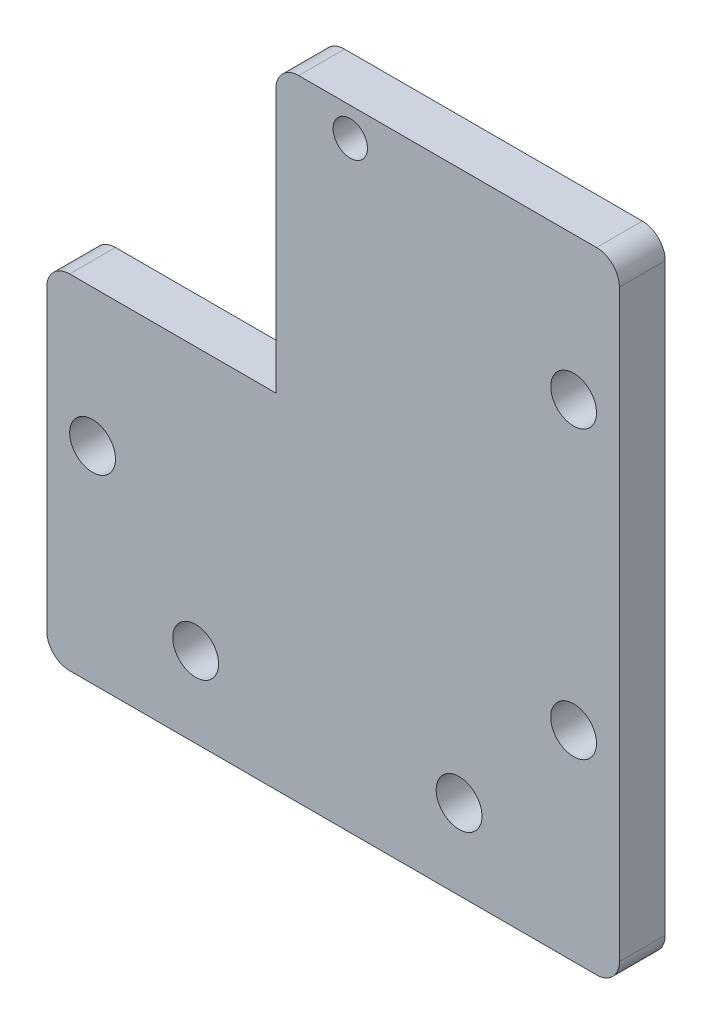
ISO-10303-21;
HEADER;
FILE_DESCRIPTION(('STEP AP214'),'2;1');
FILE_NAME('part.step','',(''),(''),'','','');
FILE_SCHEMA(('AUTOMOTIVE_DESIGN { 1 0 10303 214 1 1 1 1 }'));
ENDSEC;
DATA;
#1=APPLICATION_CONTEXT('core data for automotive mechanical design processes');
#2=APPLICATION_PROTOCOL_DEFINITION('international standard','automotive_design',2000,#1);
#3=PRODUCT_CONTEXT('',#1,'mechanical');
#4=PRODUCT('Part','Part','',(#3));
#5=PRODUCT_RELATED_PRODUCT_CATEGORY('part','',(#4));
#6=PRODUCT_DEFINITION_FORMATION('','',#4);
#7=PRODUCT_DEFINITION_CONTEXT('part definition',#1,'design');
#8=PRODUCT_DEFINITION('design','',#6,#7);
#9=PRODUCT_DEFINITION_SHAPE('','',#8);
#10=(LENGTH_UNIT() NAMED_UNIT(*) SI_UNIT(.MILLI.,.METRE.));
#11=(NAMED_UNIT(*) PLANE_ANGLE_UNIT() SI_UNIT($,.RADIAN.));
#12=(NAMED_UNIT(*) SI_UNIT($,.STERADIAN.) SOLID_ANGLE_UNIT());
#13=UNCERTAINTY_MEASURE_WITH_UNIT(LENGTH_MEASURE(1.E-05),#10,'distance_accuracy_value','');
#14=(GEOMETRIC_REPRESENTATION_CONTEXT(3) GLOBAL_UNCERTAINTY_ASSIGNED_CONTEXT((#13)) GLOBAL_UNIT_ASSIGNED_CONTEXT((#10,
#11,#12)) REPRESENTATION_CONTEXT('',''));
#15=CARTESIAN_POINT('',(0.,0.,0.));
#16=DIRECTION('',(0.,0.,1.));
#17=DIRECTION('',(1.,0.,0.));
#18=AXIS2_PLACEMENT_3D('',#15,#16,#17);
#19=CARTESIAN_POINT('',(0.,55.,4.));
#20=DIRECTION('',(-1.,0.,0.));
#21=DIRECTION('',(0.,-1.,0.));
#22=AXIS2_PLACEMENT_3D('',#19,#20,#21);
#23=PLANE('',#22);
#24=DIRECTION('',(0.,1.,0.));
#25=VECTOR('',#24,1.);
#26=CARTESIAN_POINT('',(0.,55.,4.));
#27=LINE('',#26,#25);
#28=CARTESIAN_POINT('',(0.,2.,4.));
#29=VERTEX_POINT('',#28);
#30=CARTESIAN_POINT('',(0.,53.,4.));
#31=VERTEX_POINT('',#30);
#32=EDGE_CURVE('E158',#29,#31,#27,.T.);
#33=ORIENTED_EDGE('',*,*,#32,.F.);
#34=DIRECTION('',(0.,0.,-1.));
#35=VECTOR('',#34,1.);
#36=CARTESIAN_POINT('',(0.,2.,4.));
#37=LINE('',#36,#35);
#38=CARTESIAN_POINT('',(0.,2.,0.));
#39=VERTEX_POINT('',#38);
#40=EDGE_CURVE('E190',#29,#39,#37,.T.);
#41=ORIENTED_EDGE('',*,*,#40,.T.);
#42=DIRECTION('',(0.,1.,0.));
#43=VECTOR('',#42,1.);
#44=CARTESIAN_POINT('',(0.,55.,0.));
#45=LINE('',#44,#43);
#46=CARTESIAN_POINT('',(0.,53.,0.));
#47=VERTEX_POINT('',#46);
#48=EDGE_CURVE('E143',#39,#47,#45,.T.);
#49=ORIENTED_EDGE('',*,*,#48,.T.);
#50=DIRECTION('',(0.,0.,-1.));
#51=VECTOR('',#50,1.);
#52=CARTESIAN_POINT('',(0.,53.,4.));
#53=LINE('',#52,#51);
#54=EDGE_CURVE('E188',#47,#31,#53,.F.);
#55=ORIENTED_EDGE('',*,*,#54,.T.);
#56=EDGE_LOOP('',(#33,#41,#49,#55));
#57=FACE_BOUND('',#56,.T.);
#58=ADVANCED_FACE('F32',(#57),#23,.F.);
#59=CARTESIAN_POINT('',(-30.,55.,4.));
#60=DIRECTION('',(0.,-1.,0.));
#61=DIRECTION('',(0.,0.,-1.));
#62=AXIS2_PLACEMENT_3D('',#59,#60,#61);
#63=PLANE('',#62);
#64=DIRECTION('',(-1.,0.,0.));
#65=VECTOR('',#64,1.);
#66=CARTESIAN_POINT('',(-30.,55.,4.));
#67=LINE('',#66,#65);
#68=CARTESIAN_POINT('',(-2.,55.,4.));
#69=VERTEX_POINT('',#68);
#70=CARTESIAN_POINT('',(-28.,55.,4.));
#71=VERTEX_POINT('',#70);
#72=EDGE_CURVE('E124',#69,#71,#67,.T.);
#73=ORIENTED_EDGE('',*,*,#72,.F.);
#74=DIRECTION('',(0.,0.,-1.));
#75=VECTOR('',#74,1.);
#76=CARTESIAN_POINT('',(-2.,55.,4.));
#77=LINE('',#76,#75);
#78=CARTESIAN_POINT('',(-2.,55.,0.));
#79=VERTEX_POINT('',#78);
#80=EDGE_CURVE('E195',#69,#79,#77,.T.);
#81=ORIENTED_EDGE('',*,*,#80,.T.);
#82=DIRECTION('',(-1.,0.,0.));
#83=VECTOR('',#82,1.);
#84=CARTESIAN_POINT('',(-30.,55.,0.));
#85=LINE('',#84,#83);
#86=CARTESIAN_POINT('',(-28.,55.,0.));
#87=VERTEX_POINT('',#86);
#88=EDGE_CURVE('E146',#79,#87,#85,.T.);
#89=ORIENTED_EDGE('',*,*,#88,.T.);
#90=DIRECTION('',(0.,0.,-1.));
#91=VECTOR('',#90,1.);
#92=CARTESIAN_POINT('',(-28.,55.,4.));
#93=LINE('',#92,#91);
#94=EDGE_CURVE('E193',#87,#71,#93,.F.);
#95=ORIENTED_EDGE('',*,*,#94,.T.);
#96=EDGE_LOOP('',(#73,#81,#89,#95));
#97=FACE_BOUND('',#96,.T.);
#98=ADVANCED_FACE('F263',(#97),#63,.F.);
#99=CARTESIAN_POINT('',(-30.,55.,4.));
#100=DIRECTION('',(1.,0.,0.));
#101=DIRECTION('',(0.,1.,0.));
#102=AXIS2_PLACEMENT_3D('',#99,#100,#101);
#103=PLANE('',#102);
#104=DIRECTION('',(0.,-1.,0.));
#105=VECTOR('',#104,1.);
#106=CARTESIAN_POINT('',(-30.,55.,4.));
#107=LINE('',#106,#105);
#108=CARTESIAN_POINT('',(-30.,53.,4.));
#109=VERTEX_POINT('',#108);
#110=CARTESIAN_POINT('',(-30.,30.,4.));
#111=VERTEX_POINT('',#110);
#112=EDGE_CURVE('E115',#109,#111,#107,.T.);
#113=ORIENTED_EDGE('',*,*,#112,.F.);
#114=DIRECTION('',(0.,0.,-1.));
#115=VECTOR('',#114,1.);
#116=CARTESIAN_POINT('',(-30.,53.,4.));
#117=LINE('',#116,#115);
#118=CARTESIAN_POINT('',(-30.,53.,0.));
#119=VERTEX_POINT('',#118);
#120=EDGE_CURVE('E41',#109,#119,#117,.T.);
#121=ORIENTED_EDGE('',*,*,#120,.T.);
#122=DIRECTION('',(0.,-1.,0.));
#123=VECTOR('',#122,1.);
#124=CARTESIAN_POINT('',(-30.,55.,0.));
#125=LINE('',#124,#123);
#126=CARTESIAN_POINT('',(-30.,30.,0.));
#127=VERTEX_POINT('',#126);
#128=EDGE_CURVE('E130',#119,#127,#125,.T.);
#129=ORIENTED_EDGE('',*,*,#128,.T.);
#130=DIRECTION('',(0.,0.,-1.));
#131=VECTOR('',#130,1.);
#132=CARTESIAN_POINT('',(-30.,30.,4.));
#133=LINE('',#132,#131);
#134=EDGE_CURVE('E127',#111,#127,#133,.T.);
#135=ORIENTED_EDGE('',*,*,#134,.F.);
#136=EDGE_LOOP('',(#113,#121,#129,#135));
#137=FACE_BOUND('',#136,.T.);
#138=ADVANCED_FACE('F128',(#137),#103,.F.);
#139=CARTESIAN_POINT('',(-50.,30.,4.));
#140=DIRECTION('',(0.,-1.,0.));
#141=DIRECTION('',(0.,0.,-1.));
#142=AXIS2_PLACEMENT_3D('',#139,#140,#141);
#143=PLANE('',#142);
#144=DIRECTION('',(-1.,0.,0.));
#145=VECTOR('',#144,1.);
#146=CARTESIAN_POINT('',(-50.,30.,0.));
#147=LINE('',#146,#145);
#148=CARTESIAN_POINT('',(-48.,30.,0.));
#149=VERTEX_POINT('',#148);
#150=EDGE_CURVE('E151',#127,#149,#147,.T.);
#151=ORIENTED_EDGE('',*,*,#150,.T.);
#152=DIRECTION('',(0.,0.,-1.));
#153=VECTOR('',#152,1.);
#154=CARTESIAN_POINT('',(-48.,30.,4.));
#155=LINE('',#154,#153);
#156=CARTESIAN_POINT('',(-48.,30.,4.));
#157=VERTEX_POINT('',#156);
#158=EDGE_CURVE('E11',#149,#157,#155,.F.);
#159=ORIENTED_EDGE('',*,*,#158,.T.);
#160=DIRECTION('',(-1.,0.,0.));
#161=VECTOR('',#160,1.);
#162=CARTESIAN_POINT('',(-50.,30.,4.));
#163=LINE('',#162,#161);
#164=EDGE_CURVE('E119',#111,#157,#163,.T.);
#165=ORIENTED_EDGE('',*,*,#164,.F.);
#166=ORIENTED_EDGE('',*,*,#134,.T.);
#167=EDGE_LOOP('',(#151,#159,#165,#166));
#168=FACE_BOUND('',#167,.T.);
#169=ADVANCED_FACE('F135',(#168),#143,.F.);
#170=CARTESIAN_POINT('',(-50.,30.,4.));
#171=DIRECTION('',(1.,0.,0.));
#172=DIRECTION('',(0.,1.,0.));
#173=AXIS2_PLACEMENT_3D('',#170,#171,#172);
#174=PLANE('',#173);
#175=DIRECTION('',(0.,-1.,0.));
#176=VECTOR('',#175,1.);
#177=CARTESIAN_POINT('',(-50.,30.,0.));
#178=LINE('',#177,#176);
#179=CARTESIAN_POINT('',(-50.,28.,0.));
#180=VERTEX_POINT('',#179);
#181=CARTESIAN_POINT('',(-50.,2.,0.));
#182=VERTEX_POINT('',#181);
#183=EDGE_CURVE('E153',#180,#182,#178,.T.);
#184=ORIENTED_EDGE('',*,*,#183,.T.);
#185=DIRECTION('',(0.,0.,-1.));
#186=VECTOR('',#185,1.);
#187=CARTESIAN_POINT('',(-50.,2.,4.));
#188=LINE('',#187,#186);
#189=CARTESIAN_POINT('',(-50.,2.,4.));
#190=VERTEX_POINT('',#189);
#191=EDGE_CURVE('E177',#182,#190,#188,.F.);
#192=ORIENTED_EDGE('',*,*,#191,.T.);
#193=DIRECTION('',(0.,-1.,0.));
#194=VECTOR('',#193,1.);
#195=CARTESIAN_POINT('',(-50.,30.,4.));
#196=LINE('',#195,#194);
#197=CARTESIAN_POINT('',(-50.,28.,4.));
#198=VERTEX_POINT('',#197);
#199=EDGE_CURVE('E136',#198,#190,#196,.T.);
#200=ORIENTED_EDGE('',*,*,#199,.F.);
#201=DIRECTION('',(0.,0.,-1.));
#202=VECTOR('',#201,1.);
#203=CARTESIAN_POINT('',(-50.,28.,4.));
#204=LINE('',#203,#202);
#205=EDGE_CURVE('E174',#198,#180,#204,.T.);
#206=ORIENTED_EDGE('',*,*,#205,.T.);
#207=EDGE_LOOP('',(#184,#192,#200,#206));
#208=FACE_BOUND('',#207,.T.);
#209=ADVANCED_FACE('F244',(#208),#174,.F.);
#210=CARTESIAN_POINT('',(-50.,0.,4.));
#211=DIRECTION('',(0.,1.,0.));
#212=DIRECTION('',(0.,0.,1.));
#213=AXIS2_PLACEMENT_3D('',#210,#211,#212);
#214=PLANE('',#213);
#215=DIRECTION('',(1.,0.,0.));
#216=VECTOR('',#215,1.);
#217=CARTESIAN_POINT('',(-50.,0.,4.));
#218=LINE('',#217,#216);
#219=CARTESIAN_POINT('',(-48.,0.,4.));
#220=VERTEX_POINT('',#219);
#221=CARTESIAN_POINT('',(-2.,0.,4.));
#222=VERTEX_POINT('',#221);
#223=EDGE_CURVE('E133',#220,#222,#218,.T.);
#224=ORIENTED_EDGE('',*,*,#223,.F.);
#225=DIRECTION('',(0.,0.,-1.));
#226=VECTOR('',#225,1.);
#227=CARTESIAN_POINT('',(-48.,0.,4.));
#228=LINE('',#227,#226);
#229=CARTESIAN_POINT('',(-48.,0.,0.));
#230=VERTEX_POINT('',#229);
#231=EDGE_CURVE('E161',#220,#230,#228,.T.);
#232=ORIENTED_EDGE('',*,*,#231,.T.);
#233=DIRECTION('',(1.,0.,0.));
#234=VECTOR('',#233,1.);
#235=CARTESIAN_POINT('',(-50.,0.,0.));
#236=LINE('',#235,#234);
#237=CARTESIAN_POINT('',(-2.,0.,0.));
#238=VERTEX_POINT('',#237);
#239=EDGE_CURVE('E156',#230,#238,#236,.T.);
#240=ORIENTED_EDGE('',*,*,#239,.T.);
#241=DIRECTION('',(0.,0.,-1.));
#242=VECTOR('',#241,1.);
#243=CARTESIAN_POINT('',(-2.,0.,4.));
#244=LINE('',#243,#242);
#245=EDGE_CURVE('E132',#238,#222,#244,.F.);
#246=ORIENTED_EDGE('',*,*,#245,.T.);
#247=EDGE_LOOP('',(#224,#232,#240,#246));
#248=FACE_BOUND('',#247,.T.);
#249=ADVANCED_FACE('F252',(#248),#214,.F.);
#250=CARTESIAN_POINT('',(0.,0.,4.));
#251=DIRECTION('',(0.,0.,1.));
#252=DIRECTION('',(1.,0.,0.));
#253=AXIS2_PLACEMENT_3D('',#250,#251,#252);
#254=PLANE('',#253);
#255=CARTESIAN_POINT('',(-45.9999999999976,17.9999999999999,4.));
#256=DIRECTION('',(0.,0.,1.));
#257=DIRECTION('',(1.,0.,0.));
#258=AXIS2_PLACEMENT_3D('',#255,#256,#257);
#259=CIRCLE('',#258,2.);
#260=CARTESIAN_POINT('',(-43.9999999999976,17.9999999999999,4.));
#261=VERTEX_POINT('',#260);
#262=EDGE_CURVE('E206',#261,#261,#259,.T.);
#263=ORIENTED_EDGE('',*,*,#262,.F.);
#264=EDGE_LOOP('',(#263));
#265=FACE_BOUND('',#264,.T.);
#266=CARTESIAN_POINT('',(-36.9999999999976,6.99999999999994,4.));
#267=DIRECTION('',(0.,0.,1.));
#268=DIRECTION('',(1.,0.,0.));
#269=AXIS2_PLACEMENT_3D('',#266,#267,#268);
#270=CIRCLE('',#269,2.);
#271=CARTESIAN_POINT('',(-34.9999999999976,6.99999999999994,4.));
#272=VERTEX_POINT('',#271);
#273=EDGE_CURVE('E402',#272,#272,#270,.T.);
#274=ORIENTED_EDGE('',*,*,#273,.F.);
#275=EDGE_LOOP('',(#274));
#276=FACE_BOUND('',#275,.T.);
#277=CARTESIAN_POINT('',(-13.9999999999976,6.99999999999994,4.));
#278=DIRECTION('',(0.,0.,1.));
#279=DIRECTION('',(1.,0.,0.));
#280=AXIS2_PLACEMENT_3D('',#277,#278,#279);
#281=CIRCLE('',#280,2.);
#282=CARTESIAN_POINT('',(-11.9999999999976,6.99999999999994,4.));
#283=VERTEX_POINT('',#282);
#284=EDGE_CURVE('E405',#283,#283,#281,.T.);
#285=ORIENTED_EDGE('',*,*,#284,.F.);
#286=EDGE_LOOP('',(#285));
#287=FACE_BOUND('',#286,.T.);
#288=CARTESIAN_POINT('',(-3.99999999999761,17.4999999999999,4.));
#289=DIRECTION('',(0.,0.,1.));
#290=DIRECTION('',(1.,0.,0.));
#291=AXIS2_PLACEMENT_3D('',#288,#289,#290);
#292=CIRCLE('',#291,2.);
#293=CARTESIAN_POINT('',(-1.99999999999761,17.4999999999999,4.));
#294=VERTEX_POINT('',#293);
#295=EDGE_CURVE('E409',#294,#294,#292,.T.);
#296=ORIENTED_EDGE('',*,*,#295,.F.);
#297=EDGE_LOOP('',(#296));
#298=FACE_BOUND('',#297,.T.);
#299=CARTESIAN_POINT('',(-3.99999999999761,42.4999999999999,4.));
#300=DIRECTION('',(0.,0.,1.));
#301=DIRECTION('',(1.,0.,0.));
#302=AXIS2_PLACEMENT_3D('',#299,#300,#301);
#303=CIRCLE('',#302,2.);
#304=CARTESIAN_POINT('',(-1.99999999999761,42.4999999999999,4.));
#305=VERTEX_POINT('',#304);
#306=EDGE_CURVE('E224',#305,#305,#303,.T.);
#307=ORIENTED_EDGE('',*,*,#306,.F.);
#308=EDGE_LOOP('',(#307));
#309=FACE_BOUND('',#308,.T.);
#310=CARTESIAN_POINT('',(-23.4999999999976,52.5,4.));
#311=DIRECTION('',(0.,0.,1.));
#312=DIRECTION('',(1.,0.,0.));
#313=AXIS2_PLACEMENT_3D('',#310,#311,#312);
#314=CIRCLE('',#313,1.5);
#315=CARTESIAN_POINT('',(-21.9999999999976,52.5,4.));
#316=VERTEX_POINT('',#315);
#317=EDGE_CURVE('E201',#316,#316,#314,.T.);
#318=ORIENTED_EDGE('',*,*,#317,.F.);
#319=EDGE_LOOP('',(#318));
#320=FACE_BOUND('',#319,.T.);
#321=ORIENTED_EDGE('',*,*,#199,.T.);
#322=CARTESIAN_POINT('',(-48.,2.,4.));
#323=DIRECTION('',(0.,0.,1.));
#324=DIRECTION('',(1.,0.,0.));
#325=AXIS2_PLACEMENT_3D('',#322,#323,#324);
#326=CIRCLE('',#325,2.);
#327=EDGE_CURVE('E186',#190,#220,#326,.T.);
#328=ORIENTED_EDGE('',*,*,#327,.T.);
#329=ORIENTED_EDGE('',*,*,#223,.T.);
#330=CARTESIAN_POINT('',(-2.,2.,4.));
#331=DIRECTION('',(0.,0.,1.));
#332=DIRECTION('',(1.,0.,0.));
#333=AXIS2_PLACEMENT_3D('',#330,#331,#332);
#334=CIRCLE('',#333,2.);
#335=EDGE_CURVE('E184',#222,#29,#334,.T.);
#336=ORIENTED_EDGE('',*,*,#335,.T.);
#337=ORIENTED_EDGE('',*,*,#32,.T.);
#338=CARTESIAN_POINT('',(-2.,53.,4.));
#339=DIRECTION('',(0.,0.,1.));
#340=DIRECTION('',(1.,0.,0.));
#341=AXIS2_PLACEMENT_3D('',#338,#339,#340);
#342=CIRCLE('',#341,2.);
#343=EDGE_CURVE('E182',#31,#69,#342,.T.);
#344=ORIENTED_EDGE('',*,*,#343,.T.);
#345=ORIENTED_EDGE('',*,*,#72,.T.);
#346=CARTESIAN_POINT('',(-28.,53.,4.));
#347=DIRECTION('',(0.,0.,1.));
#348=DIRECTION('',(1.,0.,0.));
#349=AXIS2_PLACEMENT_3D('',#346,#347,#348);
#350=CIRCLE('',#349,2.);
#351=EDGE_CURVE('E55',#71,#109,#350,.T.);
#352=ORIENTED_EDGE('',*,*,#351,.T.);
#353=ORIENTED_EDGE('',*,*,#112,.T.);
#354=ORIENTED_EDGE('',*,*,#164,.T.);
#355=CARTESIAN_POINT('',(-48.,28.,4.));
#356=DIRECTION('',(0.,0.,1.));
#357=DIRECTION('',(1.,0.,0.));
#358=AXIS2_PLACEMENT_3D('',#355,#356,#357);
#359=CIRCLE('',#358,2.);
#360=EDGE_CURVE('E179',#157,#198,#359,.T.);
#361=ORIENTED_EDGE('',*,*,#360,.T.);
#362=EDGE_LOOP('',(#321,#328,#329,#336,#337,#344,#345,#352,#353,#354,#361));
#363=FACE_BOUND('',#362,.T.);
#364=ADVANCED_FACE('F118',(#265,#276,#287,#298,#309,#320,#363),#254,.T.);
#365=CARTESIAN_POINT('',(0.,0.,0.));
#366=DIRECTION('',(0.,0.,1.));
#367=DIRECTION('',(1.,0.,0.));
#368=AXIS2_PLACEMENT_3D('',#365,#366,#367);
#369=PLANE('',#368);
#370=CARTESIAN_POINT('',(-45.9999999999976,17.9999999999999,0.));
#371=DIRECTION('',(0.,0.,1.));
#372=DIRECTION('',(1.,0.,0.));
#373=AXIS2_PLACEMENT_3D('',#370,#371,#372);
#374=CIRCLE('',#373,2.);
#375=CARTESIAN_POINT('',(-43.9999999999976,17.9999999999999,0.));
#376=VERTEX_POINT('',#375);
#377=EDGE_CURVE('E36',#376,#376,#374,.T.);
#378=ORIENTED_EDGE('',*,*,#377,.T.);
#379=EDGE_LOOP('',(#378));
#380=FACE_BOUND('',#379,.T.);
#381=CARTESIAN_POINT('',(-36.9999999999976,6.99999999999994,0.));
#382=DIRECTION('',(0.,0.,1.));
#383=DIRECTION('',(1.,0.,0.));
#384=AXIS2_PLACEMENT_3D('',#381,#382,#383);
#385=CIRCLE('',#384,2.);
#386=CARTESIAN_POINT('',(-34.9999999999976,6.99999999999994,0.));
#387=VERTEX_POINT('',#386);
#388=EDGE_CURVE('E211',#387,#387,#385,.T.);
#389=ORIENTED_EDGE('',*,*,#388,.T.);
#390=EDGE_LOOP('',(#389));
#391=FACE_BOUND('',#390,.T.);
#392=CARTESIAN_POINT('',(-13.9999999999976,6.99999999999994,0.));
#393=DIRECTION('',(0.,0.,1.));
#394=DIRECTION('',(1.,0.,0.));
#395=AXIS2_PLACEMENT_3D('',#392,#393,#394);
#396=CIRCLE('',#395,2.);
#397=CARTESIAN_POINT('',(-11.9999999999976,6.99999999999994,0.));
#398=VERTEX_POINT('',#397);
#399=EDGE_CURVE('E209',#398,#398,#396,.T.);
#400=ORIENTED_EDGE('',*,*,#399,.T.);
#401=EDGE_LOOP('',(#400));
#402=FACE_BOUND('',#401,.T.);
#403=CARTESIAN_POINT('',(-3.99999999999761,17.4999999999999,0.));
#404=DIRECTION('',(0.,0.,1.));
#405=DIRECTION('',(1.,0.,0.));
#406=AXIS2_PLACEMENT_3D('',#403,#404,#405);
#407=CIRCLE('',#406,2.);
#408=CARTESIAN_POINT('',(-1.99999999999761,17.4999999999999,0.));
#409=VERTEX_POINT('',#408);
#410=EDGE_CURVE('E205',#409,#409,#407,.T.);
#411=ORIENTED_EDGE('',*,*,#410,.T.);
#412=EDGE_LOOP('',(#411));
#413=FACE_BOUND('',#412,.T.);
#414=CARTESIAN_POINT('',(-3.99999999999761,42.4999999999999,0.));
#415=DIRECTION('',(0.,0.,1.));
#416=DIRECTION('',(1.,0.,0.));
#417=AXIS2_PLACEMENT_3D('',#414,#415,#416);
#418=CIRCLE('',#417,2.);
#419=CARTESIAN_POINT('',(-1.99999999999761,42.4999999999999,0.));
#420=VERTEX_POINT('',#419);
#421=EDGE_CURVE('E202',#420,#420,#418,.T.);
#422=ORIENTED_EDGE('',*,*,#421,.T.);
#423=EDGE_LOOP('',(#422));
#424=FACE_BOUND('',#423,.T.);
#425=CARTESIAN_POINT('',(-23.4999999999976,52.5,0.));
#426=DIRECTION('',(0.,0.,1.));
#427=DIRECTION('',(1.,0.,0.));
#428=AXIS2_PLACEMENT_3D('',#425,#426,#427);
#429=CIRCLE('',#428,1.5);
#430=CARTESIAN_POINT('',(-21.9999999999976,52.5,0.));
#431=VERTEX_POINT('',#430);
#432=EDGE_CURVE('E147',#431,#431,#429,.T.);
#433=ORIENTED_EDGE('',*,*,#432,.T.);
#434=EDGE_LOOP('',(#433));
#435=FACE_BOUND('',#434,.T.);
#436=ORIENTED_EDGE('',*,*,#239,.F.);
#437=CARTESIAN_POINT('',(-48.,2.,0.));
#438=DIRECTION('',(0.,0.,1.));
#439=DIRECTION('',(1.,0.,0.));
#440=AXIS2_PLACEMENT_3D('',#437,#438,#439);
#441=CIRCLE('',#440,2.);
#442=EDGE_CURVE('E172',#230,#182,#441,.F.);
#443=ORIENTED_EDGE('',*,*,#442,.T.);
#444=ORIENTED_EDGE('',*,*,#183,.F.);
#445=CARTESIAN_POINT('',(-48.,28.,0.));
#446=DIRECTION('',(0.,0.,1.));
#447=DIRECTION('',(1.,0.,0.));
#448=AXIS2_PLACEMENT_3D('',#445,#446,#447);
#449=CIRCLE('',#448,2.);
#450=EDGE_CURVE('E164',#180,#149,#449,.F.);
#451=ORIENTED_EDGE('',*,*,#450,.T.);
#452=ORIENTED_EDGE('',*,*,#150,.F.);
#453=ORIENTED_EDGE('',*,*,#128,.F.);
#454=CARTESIAN_POINT('',(-28.,53.,0.));
#455=DIRECTION('',(0.,0.,1.));
#456=DIRECTION('',(1.,0.,0.));
#457=AXIS2_PLACEMENT_3D('',#454,#455,#456);
#458=CIRCLE('',#457,2.);
#459=EDGE_CURVE('E166',#119,#87,#458,.F.);
#460=ORIENTED_EDGE('',*,*,#459,.T.);
#461=ORIENTED_EDGE('',*,*,#88,.F.);
#462=CARTESIAN_POINT('',(-2.,53.,0.));
#463=DIRECTION('',(0.,0.,1.));
#464=DIRECTION('',(1.,0.,0.));
#465=AXIS2_PLACEMENT_3D('',#462,#463,#464);
#466=CIRCLE('',#465,2.);
#467=EDGE_CURVE('E168',#79,#47,#466,.F.);
#468=ORIENTED_EDGE('',*,*,#467,.T.);
#469=ORIENTED_EDGE('',*,*,#48,.F.);
#470=CARTESIAN_POINT('',(-2.,2.,0.));
#471=DIRECTION('',(0.,0.,1.));
#472=DIRECTION('',(1.,0.,0.));
#473=AXIS2_PLACEMENT_3D('',#470,#471,#472);
#474=CIRCLE('',#473,2.);
#475=EDGE_CURVE('E170',#39,#238,#474,.F.);
#476=ORIENTED_EDGE('',*,*,#475,.T.);
#477=EDGE_LOOP('',(#436,#443,#444,#451,#452,#453,#460,#461,#468,#469,#476));
#478=FACE_BOUND('',#477,.T.);
#479=ADVANCED_FACE('F236',(#380,#391,#402,#413,#424,#435,#478),#369,.F.);
#480=CARTESIAN_POINT('',(-48.,2.,4.));
#481=DIRECTION('',(0.,0.,-1.));
#482=DIRECTION('',(-1.,0.,0.));
#483=AXIS2_PLACEMENT_3D('',#480,#481,#482);
#484=CYLINDRICAL_SURFACE('',#483,2.);
#485=ORIENTED_EDGE('',*,*,#327,.F.);
#486=ORIENTED_EDGE('',*,*,#191,.F.);
#487=ORIENTED_EDGE('',*,*,#442,.F.);
#488=ORIENTED_EDGE('',*,*,#231,.F.);
#489=EDGE_LOOP('',(#485,#486,#487,#488));
#490=FACE_BOUND('',#489,.T.);
#491=ADVANCED_FACE('F247',(#490),#484,.T.);
#492=CARTESIAN_POINT('',(-2.,2.,4.));
#493=DIRECTION('',(0.,0.,-1.));
#494=DIRECTION('',(-1.,0.,0.));
#495=AXIS2_PLACEMENT_3D('',#492,#493,#494);
#496=CYLINDRICAL_SURFACE('',#495,2.);
#497=ORIENTED_EDGE('',*,*,#335,.F.);
#498=ORIENTED_EDGE('',*,*,#245,.F.);
#499=ORIENTED_EDGE('',*,*,#475,.F.);
#500=ORIENTED_EDGE('',*,*,#40,.F.);
#501=EDGE_LOOP('',(#497,#498,#499,#500));
#502=FACE_BOUND('',#501,.T.);
#503=ADVANCED_FACE('F255',(#502),#496,.T.);
#504=CARTESIAN_POINT('',(-2.,53.,4.));
#505=DIRECTION('',(0.,0.,-1.));
#506=DIRECTION('',(-1.,0.,0.));
#507=AXIS2_PLACEMENT_3D('',#504,#505,#506);
#508=CYLINDRICAL_SURFACE('',#507,2.);
#509=ORIENTED_EDGE('',*,*,#343,.F.);
#510=ORIENTED_EDGE('',*,*,#54,.F.);
#511=ORIENTED_EDGE('',*,*,#467,.F.);
#512=ORIENTED_EDGE('',*,*,#80,.F.);
#513=EDGE_LOOP('',(#509,#510,#511,#512));
#514=FACE_BOUND('',#513,.T.);
#515=ADVANCED_FACE('F262',(#514),#508,.T.);
#516=CARTESIAN_POINT('',(-28.,53.,4.));
#517=DIRECTION('',(0.,0.,-1.));
#518=DIRECTION('',(-1.,0.,0.));
#519=AXIS2_PLACEMENT_3D('',#516,#517,#518);
#520=CYLINDRICAL_SURFACE('',#519,2.);
#521=ORIENTED_EDGE('',*,*,#351,.F.);
#522=ORIENTED_EDGE('',*,*,#94,.F.);
#523=ORIENTED_EDGE('',*,*,#459,.F.);
#524=ORIENTED_EDGE('',*,*,#120,.F.);
#525=EDGE_LOOP('',(#521,#522,#523,#524));
#526=FACE_BOUND('',#525,.T.);
#527=ADVANCED_FACE('F233',(#526),#520,.T.);
#528=CARTESIAN_POINT('',(-48.,28.,4.));
#529=DIRECTION('',(0.,0.,-1.));
#530=DIRECTION('',(-1.,0.,0.));
#531=AXIS2_PLACEMENT_3D('',#528,#529,#530);
#532=CYLINDRICAL_SURFACE('',#531,2.);
#533=ORIENTED_EDGE('',*,*,#360,.F.);
#534=ORIENTED_EDGE('',*,*,#158,.F.);
#535=ORIENTED_EDGE('',*,*,#450,.F.);
#536=ORIENTED_EDGE('',*,*,#205,.F.);
#537=EDGE_LOOP('',(#533,#534,#535,#536));
#538=FACE_BOUND('',#537,.T.);
#539=ADVANCED_FACE('F34',(#538),#532,.T.);
#540=CARTESIAN_POINT('',(-23.4999999999976,52.5,-6.));
#541=DIRECTION('',(0.,0.,1.));
#542=DIRECTION('',(1.,0.,0.));
#543=AXIS2_PLACEMENT_3D('',#540,#541,#542);
#544=CYLINDRICAL_SURFACE('',#543,1.5);
#545=ORIENTED_EDGE('',*,*,#317,.T.);
#546=EDGE_LOOP('',(#545));
#547=FACE_BOUND('',#546,.T.);
#548=ORIENTED_EDGE('',*,*,#432,.F.);
#549=EDGE_LOOP('',(#548));
#550=FACE_BOUND('',#549,.T.);
#551=ADVANCED_FACE('F283',(#547,#550),#544,.F.);
#552=CARTESIAN_POINT('',(-3.99999999999761,42.4999999999999,-6.));
#553=DIRECTION('',(0.,0.,1.));
#554=DIRECTION('',(1.,0.,0.));
#555=AXIS2_PLACEMENT_3D('',#552,#553,#554);
#556=CYLINDRICAL_SURFACE('',#555,2.);
#557=ORIENTED_EDGE('',*,*,#306,.T.);
#558=EDGE_LOOP('',(#557));
#559=FACE_BOUND('',#558,.T.);
#560=ORIENTED_EDGE('',*,*,#421,.F.);
#561=EDGE_LOOP('',(#560));
#562=FACE_BOUND('',#561,.T.);
#563=ADVANCED_FACE('F287',(#559,#562),#556,.F.);
#564=CARTESIAN_POINT('',(-3.99999999999761,17.4999999999999,-6.));
#565=DIRECTION('',(0.,0.,1.));
#566=DIRECTION('',(1.,0.,0.));
#567=AXIS2_PLACEMENT_3D('',#564,#565,#566);
#568=CYLINDRICAL_SURFACE('',#567,2.);
#569=ORIENTED_EDGE('',*,*,#295,.T.);
#570=EDGE_LOOP('',(#569));
#571=FACE_BOUND('',#570,.T.);
#572=ORIENTED_EDGE('',*,*,#410,.F.);
#573=EDGE_LOOP('',(#572));
#574=FACE_BOUND('',#573,.T.);
#575=ADVANCED_FACE('F292',(#571,#574),#568,.F.);
#576=CARTESIAN_POINT('',(-13.9999999999976,6.99999999999994,-6.));
#577=DIRECTION('',(0.,0.,1.));
#578=DIRECTION('',(1.,0.,0.));
#579=AXIS2_PLACEMENT_3D('',#576,#577,#578);
#580=CYLINDRICAL_SURFACE('',#579,2.);
#581=ORIENTED_EDGE('',*,*,#284,.T.);
#582=EDGE_LOOP('',(#581));
#583=FACE_BOUND('',#582,.T.);
#584=ORIENTED_EDGE('',*,*,#399,.F.);
#585=EDGE_LOOP('',(#584));
#586=FACE_BOUND('',#585,.T.);
#587=ADVANCED_FACE('F366',(#583,#586),#580,.F.);
#588=CARTESIAN_POINT('',(-36.9999999999976,6.99999999999994,-6.));
#589=DIRECTION('',(0.,0.,1.));
#590=DIRECTION('',(1.,0.,0.));
#591=AXIS2_PLACEMENT_3D('',#588,#589,#590);
#592=CYLINDRICAL_SURFACE('',#591,2.);
#593=ORIENTED_EDGE('',*,*,#273,.T.);
#594=EDGE_LOOP('',(#593));
#595=FACE_BOUND('',#594,.T.);
#596=ORIENTED_EDGE('',*,*,#388,.F.);
#597=EDGE_LOOP('',(#596));
#598=FACE_BOUND('',#597,.T.);
#599=ADVANCED_FACE('F374',(#595,#598),#592,.F.);
#600=CARTESIAN_POINT('',(-45.9999999999976,17.9999999999999,-6.));
#601=DIRECTION('',(0.,0.,1.));
#602=DIRECTION('',(1.,0.,0.));
#603=AXIS2_PLACEMENT_3D('',#600,#601,#602);
#604=CYLINDRICAL_SURFACE('',#603,2.);
#605=ORIENTED_EDGE('',*,*,#262,.T.);
#606=EDGE_LOOP('',(#605));
#607=FACE_BOUND('',#606,.T.);
#608=ORIENTED_EDGE('',*,*,#377,.F.);
#609=EDGE_LOOP('',(#608));
#610=FACE_BOUND('',#609,.T.);
#611=ADVANCED_FACE('F383',(#607,#610),#604,.F.);
#612=CLOSED_SHELL('',(#58,#98,#138,#169,#209,#249,#364,#479,#491,#503,#515,#527,#539,#551,#563,
#575,#587,#599,#611));
#613=MANIFOLD_SOLID_BREP('B2',#612);
#614=ADVANCED_BREP_SHAPE_REPRESENTATION('',(#18,#613),#14);
#615=SHAPE_DEFINITION_REPRESENTATION(#9,#614);
ENDSEC;
END-ISO-10303-21;
